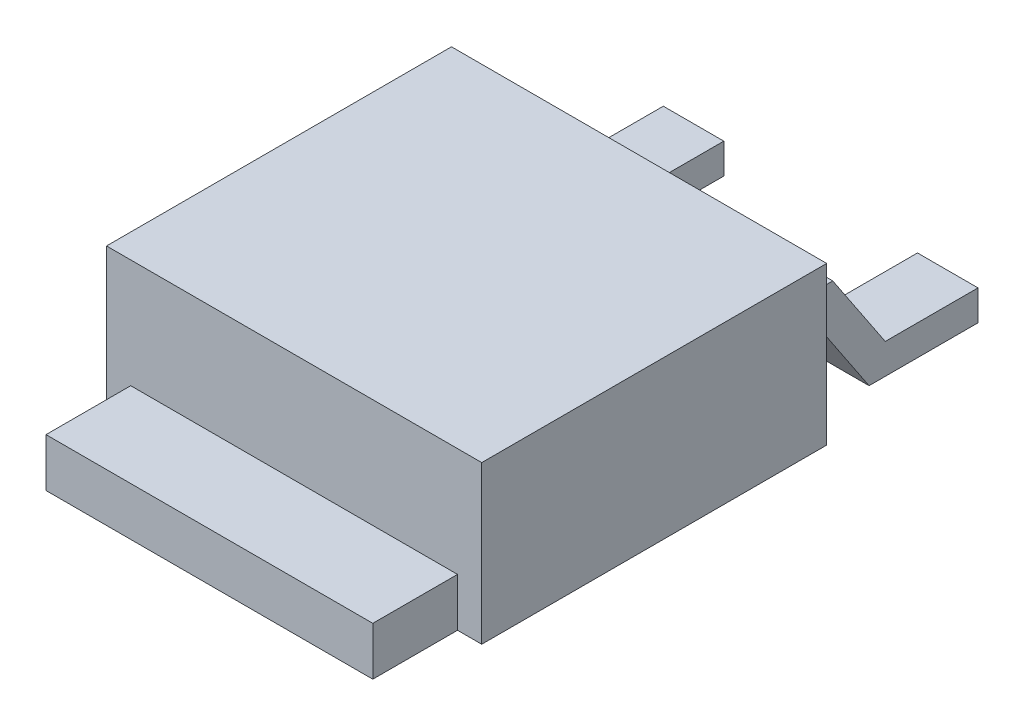
ISO-10303-21;
HEADER;
FILE_DESCRIPTION(('STEP AP214'),'2;1');
FILE_NAME('part.step','',(''),(''),'','','');
FILE_SCHEMA(('AUTOMOTIVE_DESIGN { 1 0 10303 214 1 1 1 1 }'));
ENDSEC;
DATA;
#1=APPLICATION_CONTEXT('core data for automotive mechanical design processes');
#2=APPLICATION_PROTOCOL_DEFINITION('international standard','automotive_design',2000,#1);
#3=PRODUCT_CONTEXT('',#1,'mechanical');
#4=PRODUCT('Part','Part','',(#3));
#5=PRODUCT_RELATED_PRODUCT_CATEGORY('part','',(#4));
#6=PRODUCT_DEFINITION_FORMATION('','',#4);
#7=PRODUCT_DEFINITION_CONTEXT('part definition',#1,'design');
#8=PRODUCT_DEFINITION('design','',#6,#7);
#9=PRODUCT_DEFINITION_SHAPE('','',#8);
#10=(LENGTH_UNIT() NAMED_UNIT(*) SI_UNIT(.MILLI.,.METRE.));
#11=(NAMED_UNIT(*) PLANE_ANGLE_UNIT() SI_UNIT($,.RADIAN.));
#12=(NAMED_UNIT(*) SI_UNIT($,.STERADIAN.) SOLID_ANGLE_UNIT());
#13=UNCERTAINTY_MEASURE_WITH_UNIT(LENGTH_MEASURE(1.E-05),#10,'distance_accuracy_value','');
#14=(GEOMETRIC_REPRESENTATION_CONTEXT(3) GLOBAL_UNCERTAINTY_ASSIGNED_CONTEXT((#13)) GLOBAL_UNIT_ASSIGNED_CONTEXT((#10,
#11,#12)) REPRESENTATION_CONTEXT('',''));
#15=CARTESIAN_POINT('',(0.,0.,0.));
#16=DIRECTION('',(0.,0.,1.));
#17=DIRECTION('',(1.,0.,0.));
#18=AXIS2_PLACEMENT_3D('',#15,#16,#17);
#19=CARTESIAN_POINT('',(6.2,0.,-5.7));
#20=DIRECTION('',(0.,0.,1.));
#21=DIRECTION('',(0.,-1.,0.));
#22=AXIS2_PLACEMENT_3D('',#19,#20,#21);
#23=PLANE('',#22);
#24=DIRECTION('',(0.,1.,0.));
#25=VECTOR('',#24,1.);
#26=CARTESIAN_POINT('',(1.5,1.3,-5.7));
#27=LINE('',#26,#25);
#28=CARTESIAN_POINT('',(1.5,1.3,-5.7));
#29=VERTEX_POINT('',#28);
#30=CARTESIAN_POINT('',(1.5,1.8,-5.7));
#31=VERTEX_POINT('',#30);
#32=EDGE_CURVE('E274',#29,#31,#27,.T.);
#33=ORIENTED_EDGE('',*,*,#32,.T.);
#34=DIRECTION('',(-1.,0.,0.));
#35=VECTOR('',#34,1.);
#36=CARTESIAN_POINT('',(1.5,1.8,-5.7));
#37=LINE('',#36,#35);
#38=CARTESIAN_POINT('',(0.5,1.8,-5.7));
#39=VERTEX_POINT('',#38);
#40=EDGE_CURVE('E298',#31,#39,#37,.T.);
#41=ORIENTED_EDGE('',*,*,#40,.T.);
#42=DIRECTION('',(0.,1.,0.));
#43=VECTOR('',#42,1.);
#44=CARTESIAN_POINT('',(0.5,1.3,-5.7));
#45=LINE('',#44,#43);
#46=CARTESIAN_POINT('',(0.5,1.3,-5.7));
#47=VERTEX_POINT('',#46);
#48=EDGE_CURVE('E262',#47,#39,#45,.T.);
#49=ORIENTED_EDGE('',*,*,#48,.F.);
#50=DIRECTION('',(-1.,0.,0.));
#51=VECTOR('',#50,1.);
#52=CARTESIAN_POINT('',(1.5,1.3,-5.7));
#53=LINE('',#52,#51);
#54=EDGE_CURVE('E318',#29,#47,#53,.T.);
#55=ORIENTED_EDGE('',*,*,#54,.F.);
#56=EDGE_LOOP('',(#33,#41,#49,#55));
#57=FACE_BOUND('',#56,.T.);
#58=DIRECTION('',(0.,1.,0.));
#59=VECTOR('',#58,1.);
#60=CARTESIAN_POINT('',(0.,0.,-5.7));
#61=LINE('',#60,#59);
#62=CARTESIAN_POINT('',(0.,0.,-5.7));
#63=VERTEX_POINT('',#62);
#64=CARTESIAN_POINT('',(0.,2.6,-5.7));
#65=VERTEX_POINT('',#64);
#66=EDGE_CURVE('E372',#63,#65,#61,.T.);
#67=ORIENTED_EDGE('',*,*,#66,.T.);
#68=DIRECTION('',(-1.,0.,0.));
#69=VECTOR('',#68,1.);
#70=CARTESIAN_POINT('',(6.2,2.6,-5.7));
#71=LINE('',#70,#69);
#72=CARTESIAN_POINT('',(6.2,2.6,-5.7));
#73=VERTEX_POINT('',#72);
#74=EDGE_CURVE('E377',#73,#65,#71,.T.);
#75=ORIENTED_EDGE('',*,*,#74,.F.);
#76=DIRECTION('',(0.,1.,0.));
#77=VECTOR('',#76,1.);
#78=CARTESIAN_POINT('',(6.2,0.,-5.7));
#79=LINE('',#78,#77);
#80=CARTESIAN_POINT('',(6.2,0.,-5.7));
#81=VERTEX_POINT('',#80);
#82=EDGE_CURVE('E361',#81,#73,#79,.T.);
#83=ORIENTED_EDGE('',*,*,#82,.F.);
#84=DIRECTION('',(-1.,0.,0.));
#85=VECTOR('',#84,1.);
#86=CARTESIAN_POINT('',(6.2,0.,-5.7));
#87=LINE('',#86,#85);
#88=EDGE_CURVE('E380',#81,#63,#87,.T.);
#89=ORIENTED_EDGE('',*,*,#88,.T.);
#90=EDGE_LOOP('',(#67,#75,#83,#89));
#91=FACE_BOUND('',#90,.T.);
#92=DIRECTION('',(0.,1.,0.));
#93=VECTOR('',#92,1.);
#94=CARTESIAN_POINT('',(5.7,1.3,-5.7));
#95=LINE('',#94,#93);
#96=CARTESIAN_POINT('',(5.7,1.3,-5.7));
#97=VERTEX_POINT('',#96);
#98=CARTESIAN_POINT('',(5.7,1.8,-5.7));
#99=VERTEX_POINT('',#98);
#100=EDGE_CURVE('E219',#97,#99,#95,.T.);
#101=ORIENTED_EDGE('',*,*,#100,.T.);
#102=DIRECTION('',(-1.,0.,0.));
#103=VECTOR('',#102,1.);
#104=CARTESIAN_POINT('',(5.7,1.8,-5.7));
#105=LINE('',#104,#103);
#106=CARTESIAN_POINT('',(4.7,1.8,-5.7));
#107=VERTEX_POINT('',#106);
#108=EDGE_CURVE('E203',#99,#107,#105,.T.);
#109=ORIENTED_EDGE('',*,*,#108,.T.);
#110=DIRECTION('',(0.,1.,0.));
#111=VECTOR('',#110,1.);
#112=CARTESIAN_POINT('',(4.7,1.3,-5.7));
#113=LINE('',#112,#111);
#114=CARTESIAN_POINT('',(4.7,1.3,-5.7));
#115=VERTEX_POINT('',#114);
#116=EDGE_CURVE('E245',#115,#107,#113,.T.);
#117=ORIENTED_EDGE('',*,*,#116,.F.);
#118=DIRECTION('',(-1.,0.,0.));
#119=VECTOR('',#118,1.);
#120=CARTESIAN_POINT('',(5.7,1.3,-5.7));
#121=LINE('',#120,#119);
#122=EDGE_CURVE('E226',#97,#115,#121,.T.);
#123=ORIENTED_EDGE('',*,*,#122,.F.);
#124=EDGE_LOOP('',(#101,#109,#117,#123));
#125=FACE_BOUND('',#124,.T.);
#126=ADVANCED_FACE('F35',(#57,#91,#125),#23,.F.);
#127=CARTESIAN_POINT('',(6.2,0.,0.));
#128=DIRECTION('',(0.,0.,-1.));
#129=DIRECTION('',(0.,1.,0.));
#130=AXIS2_PLACEMENT_3D('',#127,#128,#129);
#131=PLANE('',#130);
#132=DIRECTION('',(0.,-1.,0.));
#133=VECTOR('',#132,1.);
#134=CARTESIAN_POINT('',(0.4,0.,0.));
#135=LINE('',#134,#133);
#136=CARTESIAN_POINT('',(0.4,0.8,0.));
#137=VERTEX_POINT('',#136);
#138=CARTESIAN_POINT('',(0.400000000000004,0.,0.));
#139=VERTEX_POINT('',#138);
#140=EDGE_CURVE('E39',#137,#139,#135,.T.);
#141=ORIENTED_EDGE('',*,*,#140,.F.);
#142=DIRECTION('',(-1.,0.,0.));
#143=VECTOR('',#142,1.);
#144=CARTESIAN_POINT('',(0.4,0.8,0.));
#145=LINE('',#144,#143);
#146=CARTESIAN_POINT('',(5.8,0.8,0.));
#147=VERTEX_POINT('',#146);
#148=EDGE_CURVE('E338',#147,#137,#145,.T.);
#149=ORIENTED_EDGE('',*,*,#148,.F.);
#150=DIRECTION('',(0.,1.,0.));
#151=VECTOR('',#150,1.);
#152=CARTESIAN_POINT('',(5.8,0.,0.));
#153=LINE('',#152,#151);
#154=CARTESIAN_POINT('',(5.8,0.,0.));
#155=VERTEX_POINT('',#154);
#156=EDGE_CURVE('E348',#155,#147,#153,.T.);
#157=ORIENTED_EDGE('',*,*,#156,.F.);
#158=DIRECTION('',(-1.,0.,0.));
#159=VECTOR('',#158,1.);
#160=CARTESIAN_POINT('',(6.2,0.,0.));
#161=LINE('',#160,#159);
#162=CARTESIAN_POINT('',(6.2,0.,0.));
#163=VERTEX_POINT('',#162);
#164=EDGE_CURVE('E11',#163,#155,#161,.T.);
#165=ORIENTED_EDGE('',*,*,#164,.F.);
#166=DIRECTION('',(0.,-1.,0.));
#167=VECTOR('',#166,1.);
#168=CARTESIAN_POINT('',(6.2,0.,0.));
#169=LINE('',#168,#167);
#170=CARTESIAN_POINT('',(6.2,2.6,0.));
#171=VERTEX_POINT('',#170);
#172=EDGE_CURVE('E355',#171,#163,#169,.T.);
#173=ORIENTED_EDGE('',*,*,#172,.F.);
#174=DIRECTION('',(-1.,0.,0.));
#175=VECTOR('',#174,1.);
#176=CARTESIAN_POINT('',(6.2,2.6,0.));
#177=LINE('',#176,#175);
#178=CARTESIAN_POINT('',(0.,2.6,0.));
#179=VERTEX_POINT('',#178);
#180=EDGE_CURVE('E365',#171,#179,#177,.T.);
#181=ORIENTED_EDGE('',*,*,#180,.T.);
#182=DIRECTION('',(0.,-1.,0.));
#183=VECTOR('',#182,1.);
#184=CARTESIAN_POINT('',(0.,0.,0.));
#185=LINE('',#184,#183);
#186=CARTESIAN_POINT('',(0.,0.,0.));
#187=VERTEX_POINT('',#186);
#188=EDGE_CURVE('E366',#179,#187,#185,.T.);
#189=ORIENTED_EDGE('',*,*,#188,.T.);
#190=EDGE_CURVE('E45',#139,#187,#161,.T.);
#191=ORIENTED_EDGE('',*,*,#190,.F.);
#192=EDGE_LOOP('',(#141,#149,#157,#165,#173,#181,#189,#191));
#193=FACE_BOUND('',#192,.T.);
#194=ADVANCED_FACE('F37',(#193),#131,.F.);
#195=CARTESIAN_POINT('',(6.2,0.,0.));
#196=DIRECTION('',(0.,1.,0.));
#197=DIRECTION('',(0.,0.,1.));
#198=AXIS2_PLACEMENT_3D('',#195,#196,#197);
#199=PLANE('',#198);
#200=DIRECTION('',(0.,0.,-1.));
#201=VECTOR('',#200,1.);
#202=CARTESIAN_POINT('',(0.,0.,0.));
#203=LINE('',#202,#201);
#204=EDGE_CURVE('E369',#187,#63,#203,.T.);
#205=ORIENTED_EDGE('',*,*,#204,.T.);
#206=ORIENTED_EDGE('',*,*,#88,.F.);
#207=DIRECTION('',(0.,0.,-1.));
#208=VECTOR('',#207,1.);
#209=CARTESIAN_POINT('',(6.2,0.,0.));
#210=LINE('',#209,#208);
#211=EDGE_CURVE('E358',#163,#81,#210,.T.);
#212=ORIENTED_EDGE('',*,*,#211,.F.);
#213=ORIENTED_EDGE('',*,*,#164,.T.);
#214=DIRECTION('',(0.,0.,-1.));
#215=VECTOR('',#214,1.);
#216=CARTESIAN_POINT('',(5.8,0.,1.4));
#217=LINE('',#216,#215);
#218=CARTESIAN_POINT('',(5.8,0.,1.4));
#219=VERTEX_POINT('',#218);
#220=EDGE_CURVE('E354',#219,#155,#217,.T.);
#221=ORIENTED_EDGE('',*,*,#220,.F.);
#222=DIRECTION('',(1.,0.,0.));
#223=VECTOR('',#222,1.);
#224=CARTESIAN_POINT('',(0.4,0.,1.4));
#225=LINE('',#224,#223);
#226=CARTESIAN_POINT('',(0.4,0.,1.4));
#227=VERTEX_POINT('',#226);
#228=EDGE_CURVE('E337',#227,#219,#225,.T.);
#229=ORIENTED_EDGE('',*,*,#228,.F.);
#230=DIRECTION('',(0.,0.,-1.));
#231=VECTOR('',#230,1.);
#232=CARTESIAN_POINT('',(0.4,0.,1.4));
#233=LINE('',#232,#231);
#234=EDGE_CURVE('E370',#227,#139,#233,.T.);
#235=ORIENTED_EDGE('',*,*,#234,.T.);
#236=ORIENTED_EDGE('',*,*,#190,.T.);
#237=EDGE_LOOP('',(#205,#206,#212,#213,#221,#229,#235,#236));
#238=FACE_BOUND('',#237,.T.);
#239=ADVANCED_FACE('F400',(#238),#199,.F.);
#240=CARTESIAN_POINT('',(6.2,2.6,0.));
#241=DIRECTION('',(0.,-1.,0.));
#242=DIRECTION('',(0.,0.,-1.));
#243=AXIS2_PLACEMENT_3D('',#240,#241,#242);
#244=PLANE('',#243);
#245=DIRECTION('',(0.,0.,1.));
#246=VECTOR('',#245,1.);
#247=CARTESIAN_POINT('',(0.,2.6,0.));
#248=LINE('',#247,#246);
#249=EDGE_CURVE('E359',#65,#179,#248,.T.);
#250=ORIENTED_EDGE('',*,*,#249,.T.);
#251=ORIENTED_EDGE('',*,*,#180,.F.);
#252=DIRECTION('',(0.,0.,1.));
#253=VECTOR('',#252,1.);
#254=CARTESIAN_POINT('',(6.2,2.6,0.));
#255=LINE('',#254,#253);
#256=EDGE_CURVE('E363',#73,#171,#255,.T.);
#257=ORIENTED_EDGE('',*,*,#256,.F.);
#258=ORIENTED_EDGE('',*,*,#74,.T.);
#259=EDGE_LOOP('',(#250,#251,#257,#258));
#260=FACE_BOUND('',#259,.T.);
#261=ADVANCED_FACE('F431',(#260),#244,.F.);
#262=CARTESIAN_POINT('',(6.2,0.,0.));
#263=DIRECTION('',(-1.,0.,0.));
#264=DIRECTION('',(0.,0.,1.));
#265=AXIS2_PLACEMENT_3D('',#262,#263,#264);
#266=PLANE('',#265);
#267=ORIENTED_EDGE('',*,*,#172,.T.);
#268=ORIENTED_EDGE('',*,*,#211,.T.);
#269=ORIENTED_EDGE('',*,*,#82,.T.);
#270=ORIENTED_EDGE('',*,*,#256,.T.);
#271=EDGE_LOOP('',(#267,#268,#269,#270));
#272=FACE_BOUND('',#271,.T.);
#273=ADVANCED_FACE('F420',(#272),#266,.F.);
#274=CARTESIAN_POINT('',(0.,0.,0.));
#275=DIRECTION('',(-1.,0.,0.));
#276=DIRECTION('',(0.,0.,1.));
#277=AXIS2_PLACEMENT_3D('',#274,#275,#276);
#278=PLANE('',#277);
#279=ORIENTED_EDGE('',*,*,#188,.F.);
#280=ORIENTED_EDGE('',*,*,#249,.F.);
#281=ORIENTED_EDGE('',*,*,#66,.F.);
#282=ORIENTED_EDGE('',*,*,#204,.F.);
#283=EDGE_LOOP('',(#279,#280,#281,#282));
#284=FACE_BOUND('',#283,.T.);
#285=ADVANCED_FACE('F427',(#284),#278,.T.);
#286=CARTESIAN_POINT('',(0.4,0.,1.4));
#287=DIRECTION('',(1.,0.,0.));
#288=DIRECTION('',(0.,1.,0.));
#289=AXIS2_PLACEMENT_3D('',#286,#287,#288);
#290=PLANE('',#289);
#291=ORIENTED_EDGE('',*,*,#140,.T.);
#292=ORIENTED_EDGE('',*,*,#234,.F.);
#293=DIRECTION('',(0.,-1.,0.));
#294=VECTOR('',#293,1.);
#295=CARTESIAN_POINT('',(0.4,0.,1.4));
#296=LINE('',#295,#294);
#297=CARTESIAN_POINT('',(0.4,0.8,1.4));
#298=VERTEX_POINT('',#297);
#299=EDGE_CURVE('E334',#298,#227,#296,.T.);
#300=ORIENTED_EDGE('',*,*,#299,.F.);
#301=DIRECTION('',(0.,0.,-1.));
#302=VECTOR('',#301,1.);
#303=CARTESIAN_POINT('',(0.4,0.8,1.4));
#304=LINE('',#303,#302);
#305=EDGE_CURVE('E343',#298,#137,#304,.T.);
#306=ORIENTED_EDGE('',*,*,#305,.T.);
#307=EDGE_LOOP('',(#291,#292,#300,#306));
#308=FACE_BOUND('',#307,.T.);
#309=ADVANCED_FACE('F405',(#308),#290,.F.);
#310=CARTESIAN_POINT('',(5.8,0.,1.4));
#311=DIRECTION('',(-1.,0.,0.));
#312=DIRECTION('',(0.,0.,1.));
#313=AXIS2_PLACEMENT_3D('',#310,#311,#312);
#314=PLANE('',#313);
#315=ORIENTED_EDGE('',*,*,#156,.T.);
#316=DIRECTION('',(0.,0.,-1.));
#317=VECTOR('',#316,1.);
#318=CARTESIAN_POINT('',(5.8,0.8,1.4));
#319=LINE('',#318,#317);
#320=CARTESIAN_POINT('',(5.8,0.8,1.4));
#321=VERTEX_POINT('',#320);
#322=EDGE_CURVE('E351',#321,#147,#319,.T.);
#323=ORIENTED_EDGE('',*,*,#322,.F.);
#324=DIRECTION('',(0.,1.,0.));
#325=VECTOR('',#324,1.);
#326=CARTESIAN_POINT('',(5.8,0.,1.4));
#327=LINE('',#326,#325);
#328=EDGE_CURVE('E340',#219,#321,#327,.T.);
#329=ORIENTED_EDGE('',*,*,#328,.F.);
#330=ORIENTED_EDGE('',*,*,#220,.T.);
#331=EDGE_LOOP('',(#315,#323,#329,#330));
#332=FACE_BOUND('',#331,.T.);
#333=ADVANCED_FACE('F414',(#332),#314,.F.);
#334=CARTESIAN_POINT('',(0.4,0.8,1.4));
#335=DIRECTION('',(0.,-1.,0.));
#336=DIRECTION('',(0.,0.,-1.));
#337=AXIS2_PLACEMENT_3D('',#334,#335,#336);
#338=PLANE('',#337);
#339=ORIENTED_EDGE('',*,*,#148,.T.);
#340=ORIENTED_EDGE('',*,*,#305,.F.);
#341=DIRECTION('',(-1.,0.,0.));
#342=VECTOR('',#341,1.);
#343=CARTESIAN_POINT('',(0.4,0.8,1.4));
#344=LINE('',#343,#342);
#345=EDGE_CURVE('E342',#321,#298,#344,.T.);
#346=ORIENTED_EDGE('',*,*,#345,.F.);
#347=ORIENTED_EDGE('',*,*,#322,.T.);
#348=EDGE_LOOP('',(#339,#340,#346,#347));
#349=FACE_BOUND('',#348,.T.);
#350=ADVANCED_FACE('F409',(#349),#338,.F.);
#351=CARTESIAN_POINT('',(0.,0.,1.4));
#352=DIRECTION('',(0.,0.,-1.));
#353=DIRECTION('',(-1.,0.,0.));
#354=AXIS2_PLACEMENT_3D('',#351,#352,#353);
#355=PLANE('',#354);
#356=ORIENTED_EDGE('',*,*,#299,.T.);
#357=ORIENTED_EDGE('',*,*,#228,.T.);
#358=ORIENTED_EDGE('',*,*,#328,.T.);
#359=ORIENTED_EDGE('',*,*,#345,.T.);
#360=EDGE_LOOP('',(#356,#357,#358,#359));
#361=FACE_BOUND('',#360,.T.);
#362=ADVANCED_FACE('F492',(#361),#355,.F.);
#363=CARTESIAN_POINT('',(1.5,1.3,-6.03254336483211));
#364=DIRECTION('',(0.,-1.,0.));
#365=DIRECTION('',(0.,0.,-1.));
#366=AXIS2_PLACEMENT_3D('',#363,#364,#365);
#367=PLANE('',#366);
#368=DIRECTION('',(0.,0.,1.));
#369=VECTOR('',#368,1.);
#370=CARTESIAN_POINT('',(0.5,1.3,-6.03254336483211));
#371=LINE('',#370,#369);
#372=CARTESIAN_POINT('',(0.5,1.3,-6.03254336483211));
#373=VERTEX_POINT('',#372);
#374=EDGE_CURVE('E61',#373,#47,#371,.T.);
#375=ORIENTED_EDGE('',*,*,#374,.F.);
#376=DIRECTION('',(-1.,0.,0.));
#377=VECTOR('',#376,1.);
#378=CARTESIAN_POINT('',(1.5,1.3,-6.03254336483211));
#379=LINE('',#378,#377);
#380=CARTESIAN_POINT('',(1.5,1.3,-6.03254336483211));
#381=VERTEX_POINT('',#380);
#382=EDGE_CURVE('E320',#381,#373,#379,.T.);
#383=ORIENTED_EDGE('',*,*,#382,.F.);
#384=DIRECTION('',(0.,0.,1.));
#385=VECTOR('',#384,1.);
#386=CARTESIAN_POINT('',(1.5,1.3,-6.03254336483211));
#387=LINE('',#386,#385);
#388=EDGE_CURVE('E295',#381,#29,#387,.T.);
#389=ORIENTED_EDGE('',*,*,#388,.T.);
#390=ORIENTED_EDGE('',*,*,#54,.T.);
#391=EDGE_LOOP('',(#375,#383,#389,#390));
#392=FACE_BOUND('',#391,.T.);
#393=ADVANCED_FACE('F455',(#392),#367,.T.);
#394=CARTESIAN_POINT('',(1.5,0.,-6.9));
#395=DIRECTION('',(0.,-0.555050086962052,0.831816927552823));
#396=DIRECTION('',(0.,-0.831816927552823,-0.555050086962052));
#397=AXIS2_PLACEMENT_3D('',#394,#395,#396);
#398=PLANE('',#397);
#399=DIRECTION('',(0.,0.831816927552823,0.555050086962052));
#400=VECTOR('',#399,1.);
#401=CARTESIAN_POINT('',(0.5,0.,-6.9));
#402=LINE('',#401,#400);
#403=CARTESIAN_POINT('',(0.5,0.,-6.9));
#404=VERTEX_POINT('',#403);
#405=EDGE_CURVE('E315',#404,#373,#402,.T.);
#406=ORIENTED_EDGE('',*,*,#405,.F.);
#407=DIRECTION('',(-1.,0.,0.));
#408=VECTOR('',#407,1.);
#409=CARTESIAN_POINT('',(1.5,0.,-6.9));
#410=LINE('',#409,#408);
#411=CARTESIAN_POINT('',(1.5,0.,-6.9));
#412=VERTEX_POINT('',#411);
#413=EDGE_CURVE('E322',#412,#404,#410,.T.);
#414=ORIENTED_EDGE('',*,*,#413,.F.);
#415=DIRECTION('',(0.,0.831816927552823,0.555050086962052));
#416=VECTOR('',#415,1.);
#417=CARTESIAN_POINT('',(1.5,0.,-6.9));
#418=LINE('',#417,#416);
#419=EDGE_CURVE('E292',#412,#381,#418,.T.);
#420=ORIENTED_EDGE('',*,*,#419,.T.);
#421=ORIENTED_EDGE('',*,*,#382,.T.);
#422=EDGE_LOOP('',(#406,#414,#420,#421));
#423=FACE_BOUND('',#422,.T.);
#424=ADVANCED_FACE('F458',(#423),#398,.T.);
#425=CARTESIAN_POINT('',(1.5,0.,-8.7));
#426=DIRECTION('',(0.,-1.,0.));
#427=DIRECTION('',(0.,0.,-1.));
#428=AXIS2_PLACEMENT_3D('',#425,#426,#427);
#429=PLANE('',#428);
#430=DIRECTION('',(0.,0.,1.));
#431=VECTOR('',#430,1.);
#432=CARTESIAN_POINT('',(0.5,0.,-8.7));
#433=LINE('',#432,#431);
#434=CARTESIAN_POINT('',(0.5,0.,-8.7));
#435=VERTEX_POINT('',#434);
#436=EDGE_CURVE('E312',#435,#404,#433,.T.);
#437=ORIENTED_EDGE('',*,*,#436,.F.);
#438=DIRECTION('',(-1.,0.,0.));
#439=VECTOR('',#438,1.);
#440=CARTESIAN_POINT('',(1.5,0.,-8.7));
#441=LINE('',#440,#439);
#442=CARTESIAN_POINT('',(1.5,0.,-8.7));
#443=VERTEX_POINT('',#442);
#444=EDGE_CURVE('E324',#443,#435,#441,.T.);
#445=ORIENTED_EDGE('',*,*,#444,.F.);
#446=DIRECTION('',(0.,0.,1.));
#447=VECTOR('',#446,1.);
#448=CARTESIAN_POINT('',(1.5,0.,-8.7));
#449=LINE('',#448,#447);
#450=EDGE_CURVE('E289',#443,#412,#449,.T.);
#451=ORIENTED_EDGE('',*,*,#450,.T.);
#452=ORIENTED_EDGE('',*,*,#413,.T.);
#453=EDGE_LOOP('',(#437,#445,#451,#452));
#454=FACE_BOUND('',#453,.T.);
#455=ADVANCED_FACE('F463',(#454),#429,.T.);
#456=CARTESIAN_POINT('',(1.5,0.5,-8.7));
#457=DIRECTION('',(0.,0.,-1.));
#458=DIRECTION('',(-1.,0.,0.));
#459=AXIS2_PLACEMENT_3D('',#456,#457,#458);
#460=PLANE('',#459);
#461=DIRECTION('',(0.,-1.,0.));
#462=VECTOR('',#461,1.);
#463=CARTESIAN_POINT('',(0.5,0.5,-8.7));
#464=LINE('',#463,#462);
#465=CARTESIAN_POINT('',(0.5,0.5,-8.7));
#466=VERTEX_POINT('',#465);
#467=EDGE_CURVE('E309',#466,#435,#464,.T.);
#468=ORIENTED_EDGE('',*,*,#467,.F.);
#469=DIRECTION('',(-1.,0.,0.));
#470=VECTOR('',#469,1.);
#471=CARTESIAN_POINT('',(1.5,0.5,-8.7));
#472=LINE('',#471,#470);
#473=CARTESIAN_POINT('',(1.5,0.5,-8.7));
#474=VERTEX_POINT('',#473);
#475=EDGE_CURVE('E326',#474,#466,#472,.T.);
#476=ORIENTED_EDGE('',*,*,#475,.F.);
#477=DIRECTION('',(0.,-1.,0.));
#478=VECTOR('',#477,1.);
#479=CARTESIAN_POINT('',(1.5,0.5,-8.7));
#480=LINE('',#479,#478);
#481=EDGE_CURVE('E286',#474,#443,#480,.T.);
#482=ORIENTED_EDGE('',*,*,#481,.T.);
#483=ORIENTED_EDGE('',*,*,#444,.T.);
#484=EDGE_LOOP('',(#468,#476,#482,#483));
#485=FACE_BOUND('',#484,.T.);
#486=ADVANCED_FACE('F466',(#485),#460,.T.);
#487=CARTESIAN_POINT('',(1.5,0.5,-7.16745663516789));
#488=DIRECTION('',(0.,1.,0.));
#489=DIRECTION('',(0.,0.,1.));
#490=AXIS2_PLACEMENT_3D('',#487,#488,#489);
#491=PLANE('',#490);
#492=DIRECTION('',(0.,0.,-1.));
#493=VECTOR('',#492,1.);
#494=CARTESIAN_POINT('',(0.5,0.5,-7.16745663516789));
#495=LINE('',#494,#493);
#496=CARTESIAN_POINT('',(0.5,0.5,-7.16745663516789));
#497=VERTEX_POINT('',#496);
#498=EDGE_CURVE('E306',#497,#466,#495,.T.);
#499=ORIENTED_EDGE('',*,*,#498,.F.);
#500=DIRECTION('',(-1.,0.,0.));
#501=VECTOR('',#500,1.);
#502=CARTESIAN_POINT('',(1.5,0.5,-7.16745663516789));
#503=LINE('',#502,#501);
#504=CARTESIAN_POINT('',(1.5,0.5,-7.16745663516789));
#505=VERTEX_POINT('',#504);
#506=EDGE_CURVE('E328',#505,#497,#503,.T.);
#507=ORIENTED_EDGE('',*,*,#506,.F.);
#508=DIRECTION('',(0.,0.,-1.));
#509=VECTOR('',#508,1.);
#510=CARTESIAN_POINT('',(1.5,0.5,-7.16745663516789));
#511=LINE('',#510,#509);
#512=EDGE_CURVE('E283',#505,#474,#511,.T.);
#513=ORIENTED_EDGE('',*,*,#512,.T.);
#514=ORIENTED_EDGE('',*,*,#475,.T.);
#515=EDGE_LOOP('',(#499,#507,#513,#514));
#516=FACE_BOUND('',#515,.T.);
#517=ADVANCED_FACE('F470',(#516),#491,.T.);
#518=CARTESIAN_POINT('',(1.5,1.8,-6.3));
#519=DIRECTION('',(0.,0.555050086962052,-0.831816927552823));
#520=DIRECTION('',(0.,0.831816927552823,0.555050086962052));
#521=AXIS2_PLACEMENT_3D('',#518,#519,#520);
#522=PLANE('',#521);
#523=DIRECTION('',(0.,-0.831816927552823,-0.555050086962052));
#524=VECTOR('',#523,1.);
#525=CARTESIAN_POINT('',(0.5,1.8,-6.3));
#526=LINE('',#525,#524);
#527=CARTESIAN_POINT('',(0.5,1.8,-6.3));
#528=VERTEX_POINT('',#527);
#529=EDGE_CURVE('E303',#528,#497,#526,.T.);
#530=ORIENTED_EDGE('',*,*,#529,.F.);
#531=DIRECTION('',(-1.,0.,0.));
#532=VECTOR('',#531,1.);
#533=CARTESIAN_POINT('',(1.5,1.8,-6.3));
#534=LINE('',#533,#532);
#535=CARTESIAN_POINT('',(1.5,1.8,-6.3));
#536=VERTEX_POINT('',#535);
#537=EDGE_CURVE('E330',#536,#528,#534,.T.);
#538=ORIENTED_EDGE('',*,*,#537,.F.);
#539=DIRECTION('',(0.,-0.831816927552823,-0.555050086962052));
#540=VECTOR('',#539,1.);
#541=CARTESIAN_POINT('',(1.5,1.8,-6.3));
#542=LINE('',#541,#540);
#543=EDGE_CURVE('E280',#536,#505,#542,.T.);
#544=ORIENTED_EDGE('',*,*,#543,.T.);
#545=ORIENTED_EDGE('',*,*,#506,.T.);
#546=EDGE_LOOP('',(#530,#538,#544,#545));
#547=FACE_BOUND('',#546,.T.);
#548=ADVANCED_FACE('F473',(#547),#522,.T.);
#549=CARTESIAN_POINT('',(1.5,1.8,-5.7));
#550=DIRECTION('',(0.,1.,0.));
#551=DIRECTION('',(0.,0.,1.));
#552=AXIS2_PLACEMENT_3D('',#549,#550,#551);
#553=PLANE('',#552);
#554=DIRECTION('',(0.,0.,-1.));
#555=VECTOR('',#554,1.);
#556=CARTESIAN_POINT('',(0.5,1.8,-5.7));
#557=LINE('',#556,#555);
#558=EDGE_CURVE('E300',#39,#528,#557,.T.);
#559=ORIENTED_EDGE('',*,*,#558,.F.);
#560=ORIENTED_EDGE('',*,*,#40,.F.);
#561=DIRECTION('',(0.,0.,-1.));
#562=VECTOR('',#561,1.);
#563=CARTESIAN_POINT('',(1.5,1.8,-5.7));
#564=LINE('',#563,#562);
#565=EDGE_CURVE('E277',#31,#536,#564,.T.);
#566=ORIENTED_EDGE('',*,*,#565,.T.);
#567=ORIENTED_EDGE('',*,*,#537,.T.);
#568=EDGE_LOOP('',(#559,#560,#566,#567));
#569=FACE_BOUND('',#568,.T.);
#570=ADVANCED_FACE('F475',(#569),#553,.T.);
#571=CARTESIAN_POINT('',(1.5,0.,0.));
#572=DIRECTION('',(-1.,0.,0.));
#573=DIRECTION('',(0.,0.,1.));
#574=AXIS2_PLACEMENT_3D('',#571,#572,#573);
#575=PLANE('',#574);
#576=ORIENTED_EDGE('',*,*,#32,.F.);
#577=ORIENTED_EDGE('',*,*,#388,.F.);
#578=ORIENTED_EDGE('',*,*,#419,.F.);
#579=ORIENTED_EDGE('',*,*,#450,.F.);
#580=ORIENTED_EDGE('',*,*,#481,.F.);
#581=ORIENTED_EDGE('',*,*,#512,.F.);
#582=ORIENTED_EDGE('',*,*,#543,.F.);
#583=ORIENTED_EDGE('',*,*,#565,.F.);
#584=EDGE_LOOP('',(#576,#577,#578,#579,#580,#581,#582,#583));
#585=FACE_BOUND('',#584,.T.);
#586=ADVANCED_FACE('F451',(#585),#575,.F.);
#587=CARTESIAN_POINT('',(0.5,0.,0.));
#588=DIRECTION('',(-1.,0.,0.));
#589=DIRECTION('',(0.,0.,1.));
#590=AXIS2_PLACEMENT_3D('',#587,#588,#589);
#591=PLANE('',#590);
#592=ORIENTED_EDGE('',*,*,#48,.T.);
#593=ORIENTED_EDGE('',*,*,#558,.T.);
#594=ORIENTED_EDGE('',*,*,#529,.T.);
#595=ORIENTED_EDGE('',*,*,#498,.T.);
#596=ORIENTED_EDGE('',*,*,#467,.T.);
#597=ORIENTED_EDGE('',*,*,#436,.T.);
#598=ORIENTED_EDGE('',*,*,#405,.T.);
#599=ORIENTED_EDGE('',*,*,#374,.T.);
#600=EDGE_LOOP('',(#592,#593,#594,#595,#596,#597,#598,#599));
#601=FACE_BOUND('',#600,.T.);
#602=ADVANCED_FACE('F476',(#601),#591,.T.);
#603=CARTESIAN_POINT('',(5.7,1.3,-6.03254336483211));
#604=DIRECTION('',(0.,-1.,0.));
#605=DIRECTION('',(0.,0.,-1.));
#606=AXIS2_PLACEMENT_3D('',#603,#604,#605);
#607=PLANE('',#606);
#608=DIRECTION('',(0.,0.,1.));
#609=VECTOR('',#608,1.);
#610=CARTESIAN_POINT('',(4.7,1.3,-6.03254336483211));
#611=LINE('',#610,#609);
#612=CARTESIAN_POINT('',(4.7,1.3,-6.03254336483211));
#613=VERTEX_POINT('',#612);
#614=EDGE_CURVE('E53',#613,#115,#611,.T.);
#615=ORIENTED_EDGE('',*,*,#614,.F.);
#616=DIRECTION('',(-1.,0.,0.));
#617=VECTOR('',#616,1.);
#618=CARTESIAN_POINT('',(5.7,1.3,-6.03254336483211));
#619=LINE('',#618,#617);
#620=CARTESIAN_POINT('',(5.7,1.3,-6.03254336483211));
#621=VERTEX_POINT('',#620);
#622=EDGE_CURVE('E263',#621,#613,#619,.T.);
#623=ORIENTED_EDGE('',*,*,#622,.F.);
#624=DIRECTION('',(0.,0.,1.));
#625=VECTOR('',#624,1.);
#626=CARTESIAN_POINT('',(5.7,1.3,-6.03254336483211));
#627=LINE('',#626,#625);
#628=EDGE_CURVE('E213',#621,#97,#627,.T.);
#629=ORIENTED_EDGE('',*,*,#628,.T.);
#630=ORIENTED_EDGE('',*,*,#122,.T.);
#631=EDGE_LOOP('',(#615,#623,#629,#630));
#632=FACE_BOUND('',#631,.T.);
#633=ADVANCED_FACE('F478',(#632),#607,.T.);
#634=CARTESIAN_POINT('',(5.7,0.,-6.9));
#635=DIRECTION('',(0.,-0.555050086962052,0.831816927552823));
#636=DIRECTION('',(0.,-0.831816927552823,-0.555050086962052));
#637=AXIS2_PLACEMENT_3D('',#634,#635,#636);
#638=PLANE('',#637);
#639=DIRECTION('',(0.,0.831816927552823,0.555050086962052));
#640=VECTOR('',#639,1.);
#641=CARTESIAN_POINT('',(4.7,0.,-6.9));
#642=LINE('',#641,#640);
#643=CARTESIAN_POINT('',(4.7,0.,-6.9));
#644=VERTEX_POINT('',#643);
#645=EDGE_CURVE('E228',#644,#613,#642,.T.);
#646=ORIENTED_EDGE('',*,*,#645,.F.);
#647=DIRECTION('',(-1.,0.,0.));
#648=VECTOR('',#647,1.);
#649=CARTESIAN_POINT('',(5.7,0.,-6.9));
#650=LINE('',#649,#648);
#651=CARTESIAN_POINT('',(5.7,0.,-6.9));
#652=VERTEX_POINT('',#651);
#653=EDGE_CURVE('E265',#652,#644,#650,.T.);
#654=ORIENTED_EDGE('',*,*,#653,.F.);
#655=DIRECTION('',(0.,0.831816927552823,0.555050086962052));
#656=VECTOR('',#655,1.);
#657=CARTESIAN_POINT('',(5.7,0.,-6.9));
#658=LINE('',#657,#656);
#659=EDGE_CURVE('E241',#652,#621,#658,.T.);
#660=ORIENTED_EDGE('',*,*,#659,.T.);
#661=ORIENTED_EDGE('',*,*,#622,.T.);
#662=EDGE_LOOP('',(#646,#654,#660,#661));
#663=FACE_BOUND('',#662,.T.);
#664=ADVANCED_FACE('F484',(#663),#638,.T.);
#665=CARTESIAN_POINT('',(5.7,0.,-8.7));
#666=DIRECTION('',(0.,-1.,0.));
#667=DIRECTION('',(0.,0.,-1.));
#668=AXIS2_PLACEMENT_3D('',#665,#666,#667);
#669=PLANE('',#668);
#670=DIRECTION('',(0.,0.,1.));
#671=VECTOR('',#670,1.);
#672=CARTESIAN_POINT('',(4.7,0.,-8.7));
#673=LINE('',#672,#671);
#674=CARTESIAN_POINT('',(4.7,0.,-8.7));
#675=VERTEX_POINT('',#674);
#676=EDGE_CURVE('E257',#675,#644,#673,.T.);
#677=ORIENTED_EDGE('',*,*,#676,.F.);
#678=DIRECTION('',(-1.,0.,0.));
#679=VECTOR('',#678,1.);
#680=CARTESIAN_POINT('',(5.7,0.,-8.7));
#681=LINE('',#680,#679);
#682=CARTESIAN_POINT('',(5.7,0.,-8.7));
#683=VERTEX_POINT('',#682);
#684=EDGE_CURVE('E267',#683,#675,#681,.T.);
#685=ORIENTED_EDGE('',*,*,#684,.F.);
#686=DIRECTION('',(0.,0.,1.));
#687=VECTOR('',#686,1.);
#688=CARTESIAN_POINT('',(5.7,0.,-8.7));
#689=LINE('',#688,#687);
#690=EDGE_CURVE('E238',#683,#652,#689,.T.);
#691=ORIENTED_EDGE('',*,*,#690,.T.);
#692=ORIENTED_EDGE('',*,*,#653,.T.);
#693=EDGE_LOOP('',(#677,#685,#691,#692));
#694=FACE_BOUND('',#693,.T.);
#695=ADVANCED_FACE('F591',(#694),#669,.T.);
#696=CARTESIAN_POINT('',(5.7,0.5,-8.7));
#697=DIRECTION('',(0.,0.,-1.));
#698=DIRECTION('',(-1.,0.,0.));
#699=AXIS2_PLACEMENT_3D('',#696,#697,#698);
#700=PLANE('',#699);
#701=DIRECTION('',(0.,-1.,0.));
#702=VECTOR('',#701,1.);
#703=CARTESIAN_POINT('',(4.7,0.5,-8.7));
#704=LINE('',#703,#702);
#705=CARTESIAN_POINT('',(4.7,0.5,-8.7));
#706=VERTEX_POINT('',#705);
#707=EDGE_CURVE('E254',#706,#675,#704,.T.);
#708=ORIENTED_EDGE('',*,*,#707,.F.);
#709=DIRECTION('',(-1.,0.,0.));
#710=VECTOR('',#709,1.);
#711=CARTESIAN_POINT('',(5.7,0.5,-8.7));
#712=LINE('',#711,#710);
#713=CARTESIAN_POINT('',(5.7,0.5,-8.7));
#714=VERTEX_POINT('',#713);
#715=EDGE_CURVE('E269',#714,#706,#712,.T.);
#716=ORIENTED_EDGE('',*,*,#715,.F.);
#717=DIRECTION('',(0.,-1.,0.));
#718=VECTOR('',#717,1.);
#719=CARTESIAN_POINT('',(5.7,0.5,-8.7));
#720=LINE('',#719,#718);
#721=EDGE_CURVE('E235',#714,#683,#720,.T.);
#722=ORIENTED_EDGE('',*,*,#721,.T.);
#723=ORIENTED_EDGE('',*,*,#684,.T.);
#724=EDGE_LOOP('',(#708,#716,#722,#723));
#725=FACE_BOUND('',#724,.T.);
#726=ADVANCED_FACE('F601',(#725),#700,.T.);
#727=CARTESIAN_POINT('',(5.7,0.5,-7.16745663516789));
#728=DIRECTION('',(0.,1.,0.));
#729=DIRECTION('',(0.,0.,1.));
#730=AXIS2_PLACEMENT_3D('',#727,#728,#729);
#731=PLANE('',#730);
#732=DIRECTION('',(0.,0.,-1.));
#733=VECTOR('',#732,1.);
#734=CARTESIAN_POINT('',(4.7,0.5,-7.16745663516789));
#735=LINE('',#734,#733);
#736=CARTESIAN_POINT('',(4.7,0.5,-7.16745663516789));
#737=VERTEX_POINT('',#736);
#738=EDGE_CURVE('E251',#737,#706,#735,.T.);
#739=ORIENTED_EDGE('',*,*,#738,.F.);
#740=DIRECTION('',(-1.,0.,0.));
#741=VECTOR('',#740,1.);
#742=CARTESIAN_POINT('',(5.7,0.5,-7.16745663516789));
#743=LINE('',#742,#741);
#744=CARTESIAN_POINT('',(5.7,0.5,-7.16745663516789));
#745=VERTEX_POINT('',#744);
#746=EDGE_CURVE('E271',#745,#737,#743,.T.);
#747=ORIENTED_EDGE('',*,*,#746,.F.);
#748=DIRECTION('',(0.,0.,-1.));
#749=VECTOR('',#748,1.);
#750=CARTESIAN_POINT('',(5.7,0.5,-7.16745663516789));
#751=LINE('',#750,#749);
#752=EDGE_CURVE('E232',#745,#714,#751,.T.);
#753=ORIENTED_EDGE('',*,*,#752,.T.);
#754=ORIENTED_EDGE('',*,*,#715,.T.);
#755=EDGE_LOOP('',(#739,#747,#753,#754));
#756=FACE_BOUND('',#755,.T.);
#757=ADVANCED_FACE('F611',(#756),#731,.T.);
#758=CARTESIAN_POINT('',(5.7,1.8,-6.3));
#759=DIRECTION('',(0.,0.555050086962052,-0.831816927552823));
#760=DIRECTION('',(0.,0.831816927552823,0.555050086962052));
#761=AXIS2_PLACEMENT_3D('',#758,#759,#760);
#762=PLANE('',#761);
#763=DIRECTION('',(0.,-0.831816927552823,-0.555050086962052));
#764=VECTOR('',#763,1.);
#765=CARTESIAN_POINT('',(4.7,1.8,-6.3));
#766=LINE('',#765,#764);
#767=CARTESIAN_POINT('',(4.7,1.8,-6.3));
#768=VERTEX_POINT('',#767);
#769=EDGE_CURVE('E248',#768,#737,#766,.T.);
#770=ORIENTED_EDGE('',*,*,#769,.F.);
#771=DIRECTION('',(-1.,0.,0.));
#772=VECTOR('',#771,1.);
#773=CARTESIAN_POINT('',(5.7,1.8,-6.3));
#774=LINE('',#773,#772);
#775=CARTESIAN_POINT('',(5.7,1.8,-6.3));
#776=VERTEX_POINT('',#775);
#777=EDGE_CURVE('E212',#776,#768,#774,.T.);
#778=ORIENTED_EDGE('',*,*,#777,.F.);
#779=DIRECTION('',(0.,-0.831816927552823,-0.555050086962052));
#780=VECTOR('',#779,1.);
#781=CARTESIAN_POINT('',(5.7,1.8,-6.3));
#782=LINE('',#781,#780);
#783=EDGE_CURVE('E223',#776,#745,#782,.T.);
#784=ORIENTED_EDGE('',*,*,#783,.T.);
#785=ORIENTED_EDGE('',*,*,#746,.T.);
#786=EDGE_LOOP('',(#770,#778,#784,#785));
#787=FACE_BOUND('',#786,.T.);
#788=ADVANCED_FACE('F621',(#787),#762,.T.);
#789=CARTESIAN_POINT('',(5.7,1.8,-5.7));
#790=DIRECTION('',(0.,1.,0.));
#791=DIRECTION('',(0.,0.,1.));
#792=AXIS2_PLACEMENT_3D('',#789,#790,#791);
#793=PLANE('',#792);
#794=DIRECTION('',(0.,0.,-1.));
#795=VECTOR('',#794,1.);
#796=CARTESIAN_POINT('',(4.7,1.8,-5.7));
#797=LINE('',#796,#795);
#798=EDGE_CURVE('E208',#107,#768,#797,.T.);
#799=ORIENTED_EDGE('',*,*,#798,.F.);
#800=ORIENTED_EDGE('',*,*,#108,.F.);
#801=DIRECTION('',(0.,0.,-1.));
#802=VECTOR('',#801,1.);
#803=CARTESIAN_POINT('',(5.7,1.8,-5.7));
#804=LINE('',#803,#802);
#805=EDGE_CURVE('E206',#99,#776,#804,.T.);
#806=ORIENTED_EDGE('',*,*,#805,.T.);
#807=ORIENTED_EDGE('',*,*,#777,.T.);
#808=EDGE_LOOP('',(#799,#800,#806,#807));
#809=FACE_BOUND('',#808,.T.);
#810=ADVANCED_FACE('F205',(#809),#793,.T.);
#811=CARTESIAN_POINT('',(5.7,0.,0.));
#812=DIRECTION('',(-1.,0.,0.));
#813=DIRECTION('',(0.,0.,1.));
#814=AXIS2_PLACEMENT_3D('',#811,#812,#813);
#815=PLANE('',#814);
#816=ORIENTED_EDGE('',*,*,#100,.F.);
#817=ORIENTED_EDGE('',*,*,#628,.F.);
#818=ORIENTED_EDGE('',*,*,#659,.F.);
#819=ORIENTED_EDGE('',*,*,#690,.F.);
#820=ORIENTED_EDGE('',*,*,#721,.F.);
#821=ORIENTED_EDGE('',*,*,#752,.F.);
#822=ORIENTED_EDGE('',*,*,#783,.F.);
#823=ORIENTED_EDGE('',*,*,#805,.F.);
#824=EDGE_LOOP('',(#816,#817,#818,#819,#820,#821,#822,#823));
#825=FACE_BOUND('',#824,.T.);
#826=ADVANCED_FACE('F217',(#825),#815,.F.);
#827=CARTESIAN_POINT('',(4.7,0.,0.));
#828=DIRECTION('',(-1.,0.,0.));
#829=DIRECTION('',(0.,0.,1.));
#830=AXIS2_PLACEMENT_3D('',#827,#828,#829);
#831=PLANE('',#830);
#832=ORIENTED_EDGE('',*,*,#116,.T.);
#833=ORIENTED_EDGE('',*,*,#798,.T.);
#834=ORIENTED_EDGE('',*,*,#769,.T.);
#835=ORIENTED_EDGE('',*,*,#738,.T.);
#836=ORIENTED_EDGE('',*,*,#707,.T.);
#837=ORIENTED_EDGE('',*,*,#676,.T.);
#838=ORIENTED_EDGE('',*,*,#645,.T.);
#839=ORIENTED_EDGE('',*,*,#614,.T.);
#840=EDGE_LOOP('',(#832,#833,#834,#835,#836,#837,#838,#839));
#841=FACE_BOUND('',#840,.T.);
#842=ADVANCED_FACE('F647',(#841),#831,.T.);
#843=CLOSED_SHELL('',(#126,#194,#239,#261,#273,#285,#309,#333,#350,#362,#393,#424,#455,#486,
#517,#548,#570,#586,#602,#633,#664,#695,#726,#757,#788,#810,#826,#842));
#844=MANIFOLD_SOLID_BREP('B2',#843);
#845=ADVANCED_BREP_SHAPE_REPRESENTATION('',(#18,#844),#14);
#846=SHAPE_DEFINITION_REPRESENTATION(#9,#845);
ENDSEC;
END-ISO-10303-21;
